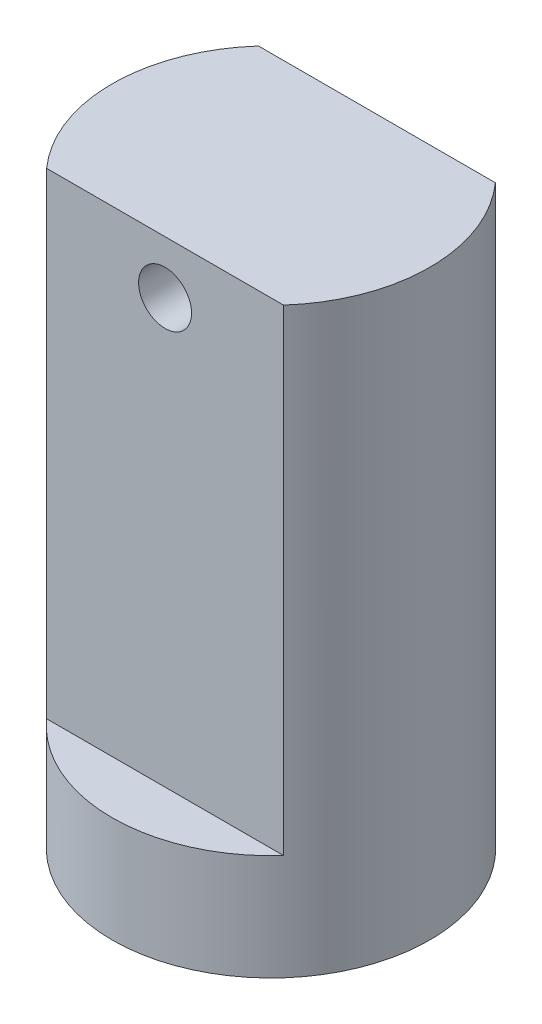
ISO-10303-21;
HEADER;
FILE_DESCRIPTION(('STEP AP214'),'2;1');
FILE_NAME('part.step','',(''),(''),'','','');
FILE_SCHEMA(('AUTOMOTIVE_DESIGN { 1 0 10303 214 1 1 1 1 }'));
ENDSEC;
DATA;
#1=APPLICATION_CONTEXT('core data for automotive mechanical design processes');
#2=APPLICATION_PROTOCOL_DEFINITION('international standard','automotive_design',2000,#1);
#3=PRODUCT_CONTEXT('',#1,'mechanical');
#4=PRODUCT('Part','Part','',(#3));
#5=PRODUCT_RELATED_PRODUCT_CATEGORY('part','',(#4));
#6=PRODUCT_DEFINITION_FORMATION('','',#4);
#7=PRODUCT_DEFINITION_CONTEXT('part definition',#1,'design');
#8=PRODUCT_DEFINITION('design','',#6,#7);
#9=PRODUCT_DEFINITION_SHAPE('','',#8);
#10=(LENGTH_UNIT() NAMED_UNIT(*) SI_UNIT(.MILLI.,.METRE.));
#11=(NAMED_UNIT(*) PLANE_ANGLE_UNIT() SI_UNIT($,.RADIAN.));
#12=(NAMED_UNIT(*) SI_UNIT($,.STERADIAN.) SOLID_ANGLE_UNIT());
#13=UNCERTAINTY_MEASURE_WITH_UNIT(LENGTH_MEASURE(1.E-05),#10,'distance_accuracy_value','');
#14=(GEOMETRIC_REPRESENTATION_CONTEXT(3) GLOBAL_UNCERTAINTY_ASSIGNED_CONTEXT((#13)) GLOBAL_UNIT_ASSIGNED_CONTEXT((#10,
#11,#12)) REPRESENTATION_CONTEXT('',''));
#15=CARTESIAN_POINT('',(0.,0.,0.));
#16=DIRECTION('',(0.,0.,1.));
#17=DIRECTION('',(1.,0.,0.));
#18=AXIS2_PLACEMENT_3D('',#15,#16,#17);
#19=CARTESIAN_POINT('',(0.,139.7,0.));
#20=DIRECTION('',(0.,-1.,0.));
#21=DIRECTION('',(0.,0.,-1.));
#22=AXIS2_PLACEMENT_3D('',#19,#20,#21);
#23=CYLINDRICAL_SURFACE('',#22,38.1);
#24=CARTESIAN_POINT('',(0.,0.,0.));
#25=DIRECTION('',(0.,1.,0.));
#26=DIRECTION('',(0.,0.,1.));
#27=AXIS2_PLACEMENT_3D('',#24,#25,#26);
#28=CIRCLE('',#27,38.1);
#29=CARTESIAN_POINT('',(0.,0.,38.1));
#30=VERTEX_POINT('',#29);
#31=EDGE_CURVE('E112',#30,#30,#28,.T.);
#32=ORIENTED_EDGE('',*,*,#31,.T.);
#33=EDGE_LOOP('',(#32));
#34=FACE_BOUND('',#33,.T.);
#35=CARTESIAN_POINT('',(0.,139.7,0.));
#36=DIRECTION('',(0.,1.,0.));
#37=DIRECTION('',(0.,0.,1.));
#38=AXIS2_PLACEMENT_3D('',#35,#36,#37);
#39=CIRCLE('',#38,38.1);
#40=CARTESIAN_POINT('',(-28.3980633142473,139.7,-25.4));
#41=VERTEX_POINT('',#40);
#42=CARTESIAN_POINT('',(-28.3980633142473,139.7,25.4));
#43=VERTEX_POINT('',#42);
#44=EDGE_CURVE('E93',#41,#43,#39,.T.);
#45=ORIENTED_EDGE('',*,*,#44,.F.);
#46=DIRECTION('',(0.,-1.,0.));
#47=VECTOR('',#46,1.);
#48=CARTESIAN_POINT('',(-28.3980633142473,139.7,-25.4));
#49=LINE('',#48,#47);
#50=CARTESIAN_POINT('',(-28.3980633142473,25.4,-25.4));
#51=VERTEX_POINT('',#50);
#52=EDGE_CURVE('E55',#41,#51,#49,.T.);
#53=ORIENTED_EDGE('',*,*,#52,.T.);
#54=CARTESIAN_POINT('',(0.,25.4,0.));
#55=DIRECTION('',(0.,-1.,0.));
#56=DIRECTION('',(0.,0.,-1.));
#57=AXIS2_PLACEMENT_3D('',#54,#55,#56);
#58=CIRCLE('',#57,38.1);
#59=CARTESIAN_POINT('',(28.3980633142473,25.4,-25.4));
#60=VERTEX_POINT('',#59);
#61=EDGE_CURVE('E11',#51,#60,#58,.T.);
#62=ORIENTED_EDGE('',*,*,#61,.T.);
#63=DIRECTION('',(0.,-1.,0.));
#64=VECTOR('',#63,1.);
#65=CARTESIAN_POINT('',(28.3980633142473,139.7,-25.4));
#66=LINE('',#65,#64);
#67=CARTESIAN_POINT('',(28.3980633142473,139.7,-25.4));
#68=VERTEX_POINT('',#67);
#69=EDGE_CURVE('E88',#60,#68,#66,.F.);
#70=ORIENTED_EDGE('',*,*,#69,.T.);
#71=CARTESIAN_POINT('',(28.3980633142473,139.7,25.4));
#72=VERTEX_POINT('',#71);
#73=EDGE_CURVE('E116',#72,#68,#39,.T.);
#74=ORIENTED_EDGE('',*,*,#73,.F.);
#75=DIRECTION('',(0.,-1.,0.));
#76=VECTOR('',#75,1.);
#77=CARTESIAN_POINT('',(28.3980633142473,139.7,25.4));
#78=LINE('',#77,#76);
#79=CARTESIAN_POINT('',(28.3980633142473,25.4,25.4));
#80=VERTEX_POINT('',#79);
#81=EDGE_CURVE('E63',#80,#72,#78,.F.);
#82=ORIENTED_EDGE('',*,*,#81,.F.);
#83=CARTESIAN_POINT('',(0.,25.4,0.));
#84=DIRECTION('',(0.,1.,0.));
#85=DIRECTION('',(0.,0.,1.));
#86=AXIS2_PLACEMENT_3D('',#83,#84,#85);
#87=CIRCLE('',#86,38.1);
#88=CARTESIAN_POINT('',(-28.3980633142473,25.4,25.4));
#89=VERTEX_POINT('',#88);
#90=EDGE_CURVE('E126',#89,#80,#87,.T.);
#91=ORIENTED_EDGE('',*,*,#90,.F.);
#92=DIRECTION('',(0.,-1.,0.));
#93=VECTOR('',#92,1.);
#94=CARTESIAN_POINT('',(-28.3980633142473,139.7,25.4));
#95=LINE('',#94,#93);
#96=EDGE_CURVE('E104',#43,#89,#95,.T.);
#97=ORIENTED_EDGE('',*,*,#96,.F.);
#98=EDGE_LOOP('',(#45,#53,#62,#70,#74,#82,#91,#97));
#99=FACE_BOUND('',#98,.T.);
#100=ADVANCED_FACE('F39',(#34,#99),#23,.T.);
#101=CARTESIAN_POINT('',(0.,139.7,0.));
#102=DIRECTION('',(0.,1.,0.));
#103=DIRECTION('',(0.,0.,1.));
#104=AXIS2_PLACEMENT_3D('',#101,#102,#103);
#105=PLANE('',#104);
#106=DIRECTION('',(1.,0.,0.));
#107=VECTOR('',#106,1.);
#108=CARTESIAN_POINT('',(0.,139.7,-25.4));
#109=LINE('',#108,#107);
#110=EDGE_CURVE('E48',#41,#68,#109,.T.);
#111=ORIENTED_EDGE('',*,*,#110,.F.);
#112=ORIENTED_EDGE('',*,*,#44,.T.);
#113=DIRECTION('',(1.,0.,0.));
#114=VECTOR('',#113,1.);
#115=CARTESIAN_POINT('',(0.,139.7,25.4));
#116=LINE('',#115,#114);
#117=EDGE_CURVE('E120',#43,#72,#116,.T.);
#118=ORIENTED_EDGE('',*,*,#117,.T.);
#119=ORIENTED_EDGE('',*,*,#73,.T.);
#120=EDGE_LOOP('',(#111,#112,#118,#119));
#121=FACE_BOUND('',#120,.T.);
#122=ADVANCED_FACE('F132',(#121),#105,.T.);
#123=CARTESIAN_POINT('',(0.,0.,0.));
#124=DIRECTION('',(0.,1.,0.));
#125=DIRECTION('',(0.,0.,1.));
#126=AXIS2_PLACEMENT_3D('',#123,#124,#125);
#127=PLANE('',#126);
#128=CARTESIAN_POINT('',(0.,0.,0.));
#129=DIRECTION('',(0.,-1.,0.));
#130=DIRECTION('',(0.,0.,-1.));
#131=AXIS2_PLACEMENT_3D('',#128,#129,#130);
#132=CIRCLE('',#131,6.35);
#133=CARTESIAN_POINT('',(0.,0.,-6.35));
#134=VERTEX_POINT('',#133);
#135=EDGE_CURVE('E107',#134,#134,#132,.T.);
#136=ORIENTED_EDGE('',*,*,#135,.F.);
#137=EDGE_LOOP('',(#136));
#138=FACE_BOUND('',#137,.T.);
#139=ORIENTED_EDGE('',*,*,#31,.F.);
#140=EDGE_LOOP('',(#139));
#141=FACE_BOUND('',#140,.T.);
#142=ADVANCED_FACE('F155',(#138,#141),#127,.F.);
#143=CARTESIAN_POINT('',(0.,25.4,0.));
#144=DIRECTION('',(0.,-1.,0.));
#145=DIRECTION('',(0.,0.,-1.));
#146=AXIS2_PLACEMENT_3D('',#143,#144,#145);
#147=CYLINDRICAL_SURFACE('',#146,6.35);
#148=CARTESIAN_POINT('',(0.,25.4,0.));
#149=DIRECTION('',(0.,-1.,0.));
#150=DIRECTION('',(0.,0.,-1.));
#151=AXIS2_PLACEMENT_3D('',#148,#149,#150);
#152=CIRCLE('',#151,6.35);
#153=CARTESIAN_POINT('',(0.,25.4,-6.35));
#154=VERTEX_POINT('',#153);
#155=EDGE_CURVE('E108',#154,#154,#152,.T.);
#156=ORIENTED_EDGE('',*,*,#155,.F.);
#157=EDGE_LOOP('',(#156));
#158=FACE_BOUND('',#157,.T.);
#159=ORIENTED_EDGE('',*,*,#135,.T.);
#160=EDGE_LOOP('',(#159));
#161=FACE_BOUND('',#160,.T.);
#162=ADVANCED_FACE('F147',(#158,#161),#147,.F.);
#163=CARTESIAN_POINT('',(0.,25.4,0.));
#164=DIRECTION('',(0.,-1.,0.));
#165=DIRECTION('',(0.,0.,-1.));
#166=AXIS2_PLACEMENT_3D('',#163,#164,#165);
#167=PLANE('',#166);
#168=ORIENTED_EDGE('',*,*,#155,.T.);
#169=EDGE_LOOP('',(#168));
#170=FACE_BOUND('',#169,.T.);
#171=ADVANCED_FACE('F139',(#170),#167,.T.);
#172=CARTESIAN_POINT('',(-38.1,25.4,50.8));
#173=DIRECTION('',(0.,1.,0.));
#174=DIRECTION('',(0.,0.,1.));
#175=AXIS2_PLACEMENT_3D('',#172,#173,#174);
#176=PLANE('',#175);
#177=ORIENTED_EDGE('',*,*,#90,.T.);
#178=DIRECTION('',(1.,0.,0.));
#179=VECTOR('',#178,1.);
#180=CARTESIAN_POINT('',(-38.1,25.4,25.4));
#181=LINE('',#180,#179);
#182=EDGE_CURVE('E95',#89,#80,#181,.T.);
#183=ORIENTED_EDGE('',*,*,#182,.F.);
#184=EDGE_LOOP('',(#177,#183));
#185=FACE_BOUND('',#184,.T.);
#186=ADVANCED_FACE('F137',(#185),#176,.T.);
#187=CARTESIAN_POINT('',(0.,0.,25.4));
#188=DIRECTION('',(0.,0.,1.));
#189=DIRECTION('',(1.,0.,0.));
#190=AXIS2_PLACEMENT_3D('',#187,#188,#189);
#191=PLANE('',#190);
#192=CARTESIAN_POINT('',(0.,127.,25.4));
#193=DIRECTION('',(0.,0.,1.));
#194=DIRECTION('',(1.,0.,0.));
#195=AXIS2_PLACEMENT_3D('',#192,#193,#194);
#196=CIRCLE('',#195,6.35);
#197=CARTESIAN_POINT('',(6.35,127.,25.4));
#198=VERTEX_POINT('',#197);
#199=EDGE_CURVE('E229',#198,#198,#196,.T.);
#200=ORIENTED_EDGE('',*,*,#199,.F.);
#201=EDGE_LOOP('',(#200));
#202=FACE_BOUND('',#201,.T.);
#203=ORIENTED_EDGE('',*,*,#96,.T.);
#204=ORIENTED_EDGE('',*,*,#182,.T.);
#205=ORIENTED_EDGE('',*,*,#81,.T.);
#206=ORIENTED_EDGE('',*,*,#117,.F.);
#207=EDGE_LOOP('',(#203,#204,#205,#206));
#208=FACE_BOUND('',#207,.T.);
#209=ADVANCED_FACE('F133',(#202,#208),#191,.T.);
#210=CARTESIAN_POINT('',(-38.1,25.4,-50.8));
#211=DIRECTION('',(0.,-1.,0.));
#212=DIRECTION('',(0.,0.,-1.));
#213=AXIS2_PLACEMENT_3D('',#210,#211,#212);
#214=PLANE('',#213);
#215=DIRECTION('',(1.,0.,0.));
#216=VECTOR('',#215,1.);
#217=CARTESIAN_POINT('',(-38.1,25.4,-25.4));
#218=LINE('',#217,#216);
#219=EDGE_CURVE('E84',#51,#60,#218,.T.);
#220=ORIENTED_EDGE('',*,*,#219,.T.);
#221=ORIENTED_EDGE('',*,*,#61,.F.);
#222=EDGE_LOOP('',(#220,#221));
#223=FACE_BOUND('',#222,.T.);
#224=ADVANCED_FACE('F83',(#223),#214,.F.);
#225=CARTESIAN_POINT('',(0.,0.,-25.4));
#226=DIRECTION('',(0.,0.,1.));
#227=DIRECTION('',(1.,0.,0.));
#228=AXIS2_PLACEMENT_3D('',#225,#226,#227);
#229=PLANE('',#228);
#230=CARTESIAN_POINT('',(0.,127.,-25.4));
#231=DIRECTION('',(0.,0.,1.));
#232=DIRECTION('',(1.,0.,0.));
#233=AXIS2_PLACEMENT_3D('',#230,#231,#232);
#234=CIRCLE('',#233,6.35);
#235=CARTESIAN_POINT('',(6.35,127.,-25.4));
#236=VERTEX_POINT('',#235);
#237=EDGE_CURVE('E42',#236,#236,#234,.T.);
#238=ORIENTED_EDGE('',*,*,#237,.T.);
#239=EDGE_LOOP('',(#238));
#240=FACE_BOUND('',#239,.T.);
#241=ORIENTED_EDGE('',*,*,#110,.T.);
#242=ORIENTED_EDGE('',*,*,#69,.F.);
#243=ORIENTED_EDGE('',*,*,#219,.F.);
#244=ORIENTED_EDGE('',*,*,#52,.F.);
#245=EDGE_LOOP('',(#241,#242,#243,#244));
#246=FACE_BOUND('',#245,.T.);
#247=ADVANCED_FACE('F87',(#240,#246),#229,.F.);
#248=CARTESIAN_POINT('',(0.,127.,-38.1));
#249=DIRECTION('',(0.,0.,1.));
#250=DIRECTION('',(1.,0.,0.));
#251=AXIS2_PLACEMENT_3D('',#248,#249,#250);
#252=CYLINDRICAL_SURFACE('',#251,6.35);
#253=ORIENTED_EDGE('',*,*,#199,.T.);
#254=EDGE_LOOP('',(#253));
#255=FACE_BOUND('',#254,.T.);
#256=ORIENTED_EDGE('',*,*,#237,.F.);
#257=EDGE_LOOP('',(#256));
#258=FACE_BOUND('',#257,.T.);
#259=ADVANCED_FACE('F212',(#255,#258),#252,.F.);
#260=CLOSED_SHELL('',(#100,#122,#142,#162,#171,#186,#209,#224,#247,#259));
#261=MANIFOLD_SOLID_BREP('B2',#260);
#262=ADVANCED_BREP_SHAPE_REPRESENTATION('',(#18,#261),#14);
#263=SHAPE_DEFINITION_REPRESENTATION(#9,#262);
ENDSEC;
END-ISO-10303-21;
